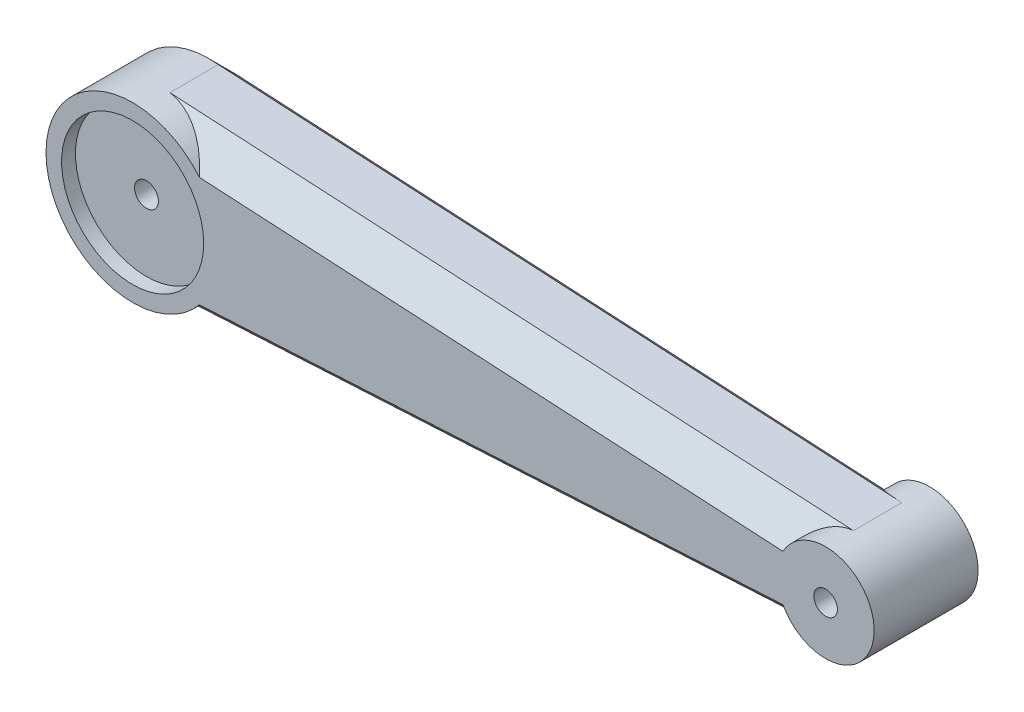
ISO-10303-21;
HEADER;
FILE_DESCRIPTION(('STEP AP214'),'2;1');
FILE_NAME('part.step','',(''),(''),'','','');
FILE_SCHEMA(('AUTOMOTIVE_DESIGN { 1 0 10303 214 1 1 1 1 }'));
ENDSEC;
DATA;
#1=APPLICATION_CONTEXT('core data for automotive mechanical design processes');
#2=APPLICATION_PROTOCOL_DEFINITION('international standard','automotive_design',2000,#1);
#3=PRODUCT_CONTEXT('',#1,'mechanical');
#4=PRODUCT('Part','Part','',(#3));
#5=PRODUCT_RELATED_PRODUCT_CATEGORY('part','',(#4));
#6=PRODUCT_DEFINITION_FORMATION('','',#4);
#7=PRODUCT_DEFINITION_CONTEXT('part definition',#1,'design');
#8=PRODUCT_DEFINITION('design','',#6,#7);
#9=PRODUCT_DEFINITION_SHAPE('','',#8);
#10=(LENGTH_UNIT() NAMED_UNIT(*) SI_UNIT(.MILLI.,.METRE.));
#11=(NAMED_UNIT(*) PLANE_ANGLE_UNIT() SI_UNIT($,.RADIAN.));
#12=(NAMED_UNIT(*) SI_UNIT($,.STERADIAN.) SOLID_ANGLE_UNIT());
#13=UNCERTAINTY_MEASURE_WITH_UNIT(LENGTH_MEASURE(1.E-05),#10,'distance_accuracy_value','');
#14=(GEOMETRIC_REPRESENTATION_CONTEXT(3) GLOBAL_UNCERTAINTY_ASSIGNED_CONTEXT((#13)) GLOBAL_UNIT_ASSIGNED_CONTEXT((#10,
#11,#12)) REPRESENTATION_CONTEXT('',''));
#15=CARTESIAN_POINT('',(0.,0.,0.));
#16=DIRECTION('',(0.,0.,1.));
#17=DIRECTION('',(1.,0.,0.));
#18=AXIS2_PLACEMENT_3D('',#15,#16,#17);
#19=CARTESIAN_POINT('',(0.,0.,15.));
#20=DIRECTION('',(0.,0.,-1.));
#21=DIRECTION('',(-1.,0.,0.));
#22=AXIS2_PLACEMENT_3D('',#19,#20,#21);
#23=CYLINDRICAL_SURFACE('',#22,12.5);
#24=CARTESIAN_POINT('',(0.,0.,15.));
#25=DIRECTION('',(0.,0.,1.));
#26=DIRECTION('',(1.,0.,0.));
#27=AXIS2_PLACEMENT_3D('',#24,#25,#26);
#28=CIRCLE('',#27,12.5);
#29=CARTESIAN_POINT('',(9.6345111325816,7.96405645611339,15.));
#30=VERTEX_POINT('',#29);
#31=CARTESIAN_POINT('',(9.6345111325816,-7.96405645611338,15.));
#32=VERTEX_POINT('',#31);
#33=EDGE_CURVE('E298',#30,#32,#28,.T.);
#34=ORIENTED_EDGE('',*,*,#33,.F.);
#35=CARTESIAN_POINT('',(0.,0.,23.4811365357126));
#36=DIRECTION('',(0.0388321836377974,0.706039702505407,0.707106781186545));
#37=DIRECTION('',(0.0388321836377972,0.706039702505403,-0.70710678118655));
#38=AXIS2_PLACEMENT_3D('',#35,#36,#37);
#39=ELLIPSE('',#38,17.6776695296637,12.5);
#40=CARTESIAN_POINT('',(1.37085316916331,12.424603075696,11.));
#41=VERTEX_POINT('',#40);
#42=EDGE_CURVE('E54',#30,#41,#39,.T.);
#43=ORIENTED_EDGE('',*,*,#42,.T.);
#44=DIRECTION('',(0.,0.,-1.));
#45=VECTOR('',#44,1.);
#46=CARTESIAN_POINT('',(1.37085316916331,12.424603075696,15.));
#47=LINE('',#46,#45);
#48=CARTESIAN_POINT('',(1.37085316916331,12.424603075696,3.99999999999999));
#49=VERTEX_POINT('',#48);
#50=EDGE_CURVE('E305',#41,#49,#47,.T.);
#51=ORIENTED_EDGE('',*,*,#50,.T.);
#52=CARTESIAN_POINT('',(0.,0.,3.99999999999999));
#53=DIRECTION('',(0.,0.,1.));
#54=DIRECTION('',(1.,0.,0.));
#55=AXIS2_PLACEMENT_3D('',#52,#53,#54);
#56=CIRCLE('',#55,12.5);
#57=CARTESIAN_POINT('',(1.37085316916331,-12.424603075696,3.99999999999999));
#58=VERTEX_POINT('',#57);
#59=EDGE_CURVE('E151',#49,#58,#56,.T.);
#60=ORIENTED_EDGE('',*,*,#59,.T.);
#61=DIRECTION('',(0.,0.,-1.));
#62=VECTOR('',#61,1.);
#63=CARTESIAN_POINT('',(1.37085316916331,-12.424603075696,15.));
#64=LINE('',#63,#62);
#65=CARTESIAN_POINT('',(1.37085316916331,-12.424603075696,11.));
#66=VERTEX_POINT('',#65);
#67=EDGE_CURVE('E121',#66,#58,#64,.T.);
#68=ORIENTED_EDGE('',*,*,#67,.F.);
#69=CARTESIAN_POINT('',(0.,0.,23.4811365357126));
#70=DIRECTION('',(0.0388321836377974,-0.706039702505407,0.707106781186545));
#71=DIRECTION('',(0.0388321836377972,-0.706039702505403,-0.70710678118655));
#72=AXIS2_PLACEMENT_3D('',#69,#70,#71);
#73=ELLIPSE('',#72,17.6776695296637,12.5);
#74=EDGE_CURVE('E329',#66,#32,#73,.T.);
#75=ORIENTED_EDGE('',*,*,#74,.T.);
#76=EDGE_LOOP('',(#34,#43,#51,#60,#68,#75));
#77=FACE_BOUND('',#76,.T.);
#78=ADVANCED_FACE('F43',(#77),#23,.T.);
#79=CARTESIAN_POINT('',(1.37085316916331,-12.424603075696,15.));
#80=DIRECTION('',(-0.0549170007571355,0.998490922857009,0.));
#81=DIRECTION('',(-0.998490922857009,-0.0549170007571355,0.));
#82=AXIS2_PLACEMENT_3D('',#79,#80,#81);
#83=PLANE('',#82);
#84=DIRECTION('',(0.,0.,-1.));
#85=VECTOR('',#84,1.);
#86=CARTESIAN_POINT('',(100.,-7.,15.));
#87=LINE('',#86,#85);
#88=CARTESIAN_POINT('',(100.,-7.,11.));
#89=VERTEX_POINT('',#88);
#90=CARTESIAN_POINT('',(100.,-7.,3.99999999999999));
#91=VERTEX_POINT('',#90);
#92=EDGE_CURVE('E110',#89,#91,#87,.T.);
#93=ORIENTED_EDGE('',*,*,#92,.F.);
#94=DIRECTION('',(-0.998490922857009,-0.0549170007571355,0.));
#95=VECTOR('',#94,1.);
#96=CARTESIAN_POINT('',(1.37085316916331,-12.424603075696,11.));
#97=LINE('',#96,#95);
#98=EDGE_CURVE('E325',#89,#66,#97,.T.);
#99=ORIENTED_EDGE('',*,*,#98,.T.);
#100=ORIENTED_EDGE('',*,*,#67,.T.);
#101=DIRECTION('',(0.998490922857009,0.0549170007571355,0.));
#102=VECTOR('',#101,1.);
#103=CARTESIAN_POINT('',(1.37085316916331,-12.424603075696,3.99999999999999));
#104=LINE('',#103,#102);
#105=EDGE_CURVE('E128',#58,#91,#104,.T.);
#106=ORIENTED_EDGE('',*,*,#105,.T.);
#107=EDGE_LOOP('',(#93,#99,#100,#106));
#108=FACE_BOUND('',#107,.T.);
#109=ADVANCED_FACE('F134',(#108),#83,.F.);
#110=CARTESIAN_POINT('',(100.,0.,15.));
#111=DIRECTION('',(0.,0.,-1.));
#112=DIRECTION('',(-1.,0.,0.));
#113=AXIS2_PLACEMENT_3D('',#110,#111,#112);
#114=CYLINDRICAL_SURFACE('',#113,7.);
#115=CARTESIAN_POINT('',(100.,0.,0.));
#116=DIRECTION('',(0.,0.,1.));
#117=DIRECTION('',(1.,0.,0.));
#118=AXIS2_PLACEMENT_3D('',#115,#116,#117);
#119=CIRCLE('',#118,7.);
#120=CARTESIAN_POINT('',(93.8441674223716,-3.33252536017493,0.));
#121=VERTEX_POINT('',#120);
#122=CARTESIAN_POINT('',(93.8441674223716,3.33252536017493,0.));
#123=VERTEX_POINT('',#122);
#124=EDGE_CURVE('E302',#121,#123,#119,.T.);
#125=ORIENTED_EDGE('',*,*,#124,.T.);
#126=CARTESIAN_POINT('',(100.,0.,-2.98943645999901));
#127=DIRECTION('',(-0.0388321836377971,-0.706039702505402,0.70710678118655));
#128=DIRECTION('',(-0.0388321836377974,-0.706039702505408,-0.707106781186545));
#129=AXIS2_PLACEMENT_3D('',#126,#127,#128);
#130=ELLIPSE('',#129,9.89949493661162,7.);
#131=CARTESIAN_POINT('',(100.,7.,3.99999999999999));
#132=VERTEX_POINT('',#131);
#133=EDGE_CURVE('E131',#123,#132,#130,.F.);
#134=ORIENTED_EDGE('',*,*,#133,.T.);
#135=DIRECTION('',(0.,0.,-1.));
#136=VECTOR('',#135,1.);
#137=CARTESIAN_POINT('',(100.,7.,15.));
#138=LINE('',#137,#136);
#139=CARTESIAN_POINT('',(100.,7.,11.));
#140=VERTEX_POINT('',#139);
#141=EDGE_CURVE('E122',#140,#132,#138,.T.);
#142=ORIENTED_EDGE('',*,*,#141,.F.);
#143=CARTESIAN_POINT('',(100.,0.,17.9894364599991));
#144=DIRECTION('',(0.0388321836377974,0.706039702505407,0.707106781186545));
#145=DIRECTION('',(0.0388321836377972,0.706039702505403,-0.70710678118655));
#146=AXIS2_PLACEMENT_3D('',#143,#144,#145);
#147=ELLIPSE('',#146,9.89949493661169,7.);
#148=CARTESIAN_POINT('',(93.8441674223716,3.33252536017493,15.));
#149=VERTEX_POINT('',#148);
#150=EDGE_CURVE('E11',#140,#149,#147,.T.);
#151=ORIENTED_EDGE('',*,*,#150,.T.);
#152=CARTESIAN_POINT('',(100.,0.,15.));
#153=DIRECTION('',(0.,0.,1.));
#154=DIRECTION('',(1.,0.,0.));
#155=AXIS2_PLACEMENT_3D('',#152,#153,#154);
#156=CIRCLE('',#155,7.);
#157=CARTESIAN_POINT('',(93.8441674223716,-3.33252536017493,15.));
#158=VERTEX_POINT('',#157);
#159=EDGE_CURVE('E301',#158,#149,#156,.T.);
#160=ORIENTED_EDGE('',*,*,#159,.F.);
#161=CARTESIAN_POINT('',(100.,0.,17.9894364599991));
#162=DIRECTION('',(0.0388321836377974,-0.706039702505407,0.707106781186545));
#163=DIRECTION('',(0.0388321836377972,-0.706039702505403,-0.70710678118655));
#164=AXIS2_PLACEMENT_3D('',#161,#162,#163);
#165=ELLIPSE('',#164,9.89949493661169,7.);
#166=EDGE_CURVE('E116',#158,#89,#165,.T.);
#167=ORIENTED_EDGE('',*,*,#166,.T.);
#168=ORIENTED_EDGE('',*,*,#92,.T.);
#169=CARTESIAN_POINT('',(100.,0.,-2.98943645999901));
#170=DIRECTION('',(-0.0388321836377971,0.706039702505402,0.70710678118655));
#171=DIRECTION('',(-0.0388321836377974,0.706039702505408,-0.707106781186545));
#172=AXIS2_PLACEMENT_3D('',#169,#170,#171);
#173=ELLIPSE('',#172,9.89949493661162,7.);
#174=EDGE_CURVE('E113',#91,#121,#173,.F.);
#175=ORIENTED_EDGE('',*,*,#174,.T.);
#176=EDGE_LOOP('',(#125,#134,#142,#151,#160,#167,#168,#175));
#177=FACE_BOUND('',#176,.T.);
#178=ADVANCED_FACE('F112',(#177),#114,.T.);
#179=CARTESIAN_POINT('',(1.37085316916331,12.424603075696,15.));
#180=DIRECTION('',(-0.0549170007571355,-0.998490922857009,0.));
#181=DIRECTION('',(0.998490922857009,-0.0549170007571355,0.));
#182=AXIS2_PLACEMENT_3D('',#179,#180,#181);
#183=PLANE('',#182);
#184=ORIENTED_EDGE('',*,*,#50,.F.);
#185=DIRECTION('',(0.998490922857009,-0.0549170007571355,0.));
#186=VECTOR('',#185,1.);
#187=CARTESIAN_POINT('',(100.,7.,11.));
#188=LINE('',#187,#186);
#189=EDGE_CURVE('E67',#41,#140,#188,.T.);
#190=ORIENTED_EDGE('',*,*,#189,.T.);
#191=ORIENTED_EDGE('',*,*,#141,.T.);
#192=DIRECTION('',(-0.998490922857009,0.0549170007571355,0.));
#193=VECTOR('',#192,1.);
#194=CARTESIAN_POINT('',(1.37085316916331,12.424603075696,3.99999999999999));
#195=LINE('',#194,#193);
#196=EDGE_CURVE('E132',#132,#49,#195,.T.);
#197=ORIENTED_EDGE('',*,*,#196,.T.);
#198=EDGE_LOOP('',(#184,#190,#191,#197));
#199=FACE_BOUND('',#198,.T.);
#200=ADVANCED_FACE('F222',(#199),#183,.F.);
#201=CARTESIAN_POINT('',(0.,0.,15.));
#202=DIRECTION('',(0.,0.,1.));
#203=DIRECTION('',(1.,0.,0.));
#204=AXIS2_PLACEMENT_3D('',#201,#202,#203);
#205=PLANE('',#204);
#206=CARTESIAN_POINT('',(100.,0.,15.));
#207=DIRECTION('',(0.,0.,-1.));
#208=DIRECTION('',(-1.,0.,0.));
#209=AXIS2_PLACEMENT_3D('',#206,#207,#208);
#210=CIRCLE('',#209,1.69999999999999);
#211=CARTESIAN_POINT('',(98.3,0.,15.));
#212=VERTEX_POINT('',#211);
#213=EDGE_CURVE('E269',#212,#212,#210,.T.);
#214=ORIENTED_EDGE('',*,*,#213,.T.);
#215=EDGE_LOOP('',(#214));
#216=FACE_BOUND('',#215,.T.);
#217=CARTESIAN_POINT('',(0.,0.,15.));
#218=DIRECTION('',(0.,0.,1.));
#219=DIRECTION('',(1.,0.,0.));
#220=AXIS2_PLACEMENT_3D('',#217,#218,#219);
#221=CIRCLE('',#220,10.25);
#222=CARTESIAN_POINT('',(10.25,0.,15.));
#223=VERTEX_POINT('',#222);
#224=EDGE_CURVE('E294',#223,#223,#221,.T.);
#225=ORIENTED_EDGE('',*,*,#224,.F.);
#226=EDGE_LOOP('',(#225));
#227=FACE_BOUND('',#226,.T.);
#228=DIRECTION('',(0.998490922857009,0.0549170007571355,0.));
#229=VECTOR('',#228,1.);
#230=CARTESIAN_POINT('',(99.7803319969715,-3.00603630857194,15.));
#231=LINE('',#230,#229);
#232=EDGE_CURVE('E331',#32,#158,#231,.T.);
#233=ORIENTED_EDGE('',*,*,#232,.T.);
#234=ORIENTED_EDGE('',*,*,#159,.T.);
#235=DIRECTION('',(-0.998490922857009,0.0549170007571355,0.));
#236=VECTOR('',#235,1.);
#237=CARTESIAN_POINT('',(1.15118516613476,8.43063938426796,15.));
#238=LINE('',#237,#236);
#239=EDGE_CURVE('E160',#149,#30,#238,.T.);
#240=ORIENTED_EDGE('',*,*,#239,.T.);
#241=ORIENTED_EDGE('',*,*,#33,.T.);
#242=EDGE_LOOP('',(#233,#234,#240,#241));
#243=FACE_BOUND('',#242,.T.);
#244=ADVANCED_FACE('F225',(#216,#227,#243),#205,.T.);
#245=CARTESIAN_POINT('',(0.,0.,0.));
#246=DIRECTION('',(0.,0.,1.));
#247=DIRECTION('',(1.,0.,0.));
#248=AXIS2_PLACEMENT_3D('',#245,#246,#247);
#249=PLANE('',#248);
#250=CARTESIAN_POINT('',(100.,0.,0.));
#251=DIRECTION('',(0.,0.,-1.));
#252=DIRECTION('',(-1.,0.,0.));
#253=AXIS2_PLACEMENT_3D('',#250,#251,#252);
#254=CIRCLE('',#253,1.725);
#255=CARTESIAN_POINT('',(98.275,0.,0.));
#256=VERTEX_POINT('',#255);
#257=EDGE_CURVE('E265',#256,#256,#254,.T.);
#258=ORIENTED_EDGE('',*,*,#257,.F.);
#259=EDGE_LOOP('',(#258));
#260=FACE_BOUND('',#259,.T.);
#261=CARTESIAN_POINT('',(0.,0.,0.));
#262=DIRECTION('',(0.,0.,-1.));
#263=DIRECTION('',(-1.,0.,0.));
#264=AXIS2_PLACEMENT_3D('',#261,#262,#263);
#265=CIRCLE('',#264,6.145);
#266=CARTESIAN_POINT('',(-6.145,0.,0.));
#267=VERTEX_POINT('',#266);
#268=EDGE_CURVE('E275',#267,#267,#265,.T.);
#269=ORIENTED_EDGE('',*,*,#268,.F.);
#270=EDGE_LOOP('',(#269));
#271=FACE_BOUND('',#270,.T.);
#272=ORIENTED_EDGE('',*,*,#124,.F.);
#273=DIRECTION('',(-0.998490922857009,-0.0549170007571355,0.));
#274=VECTOR('',#273,1.);
#275=CARTESIAN_POINT('',(0.465758581553097,-8.46833784641995,0.));
#276=LINE('',#275,#274);
#277=CARTESIAN_POINT('',(1.03087539041,-8.43725642193282,0.));
#278=VERTEX_POINT('',#277);
#279=EDGE_CURVE('E129',#121,#278,#276,.T.);
#280=ORIENTED_EDGE('',*,*,#279,.T.);
#281=CARTESIAN_POINT('',(0.,0.,0.));
#282=DIRECTION('',(0.,0.,1.));
#283=DIRECTION('',(1.,0.,0.));
#284=AXIS2_PLACEMENT_3D('',#281,#282,#283);
#285=CIRCLE('',#284,8.49999999999998);
#286=CARTESIAN_POINT('',(1.03087539041001,8.43725642193282,0.));
#287=VERTEX_POINT('',#286);
#288=EDGE_CURVE('E143',#278,#287,#285,.F.);
#289=ORIENTED_EDGE('',*,*,#288,.T.);
#290=DIRECTION('',(0.998490922857009,-0.0549170007571355,0.));
#291=VECTOR('',#290,1.);
#292=CARTESIAN_POINT('',(0.465758581553097,8.46833784641995,0.));
#293=LINE('',#292,#291);
#294=EDGE_CURVE('E138',#287,#123,#293,.T.);
#295=ORIENTED_EDGE('',*,*,#294,.T.);
#296=EDGE_LOOP('',(#272,#280,#289,#295));
#297=FACE_BOUND('',#296,.T.);
#298=ADVANCED_FACE('F195',(#260,#271,#297),#249,.F.);
#299=CARTESIAN_POINT('',(1.37085316916331,12.424603075696,3.99999999999999));
#300=DIRECTION('',(-0.0388321836377971,-0.706039702505402,0.70710678118655));
#301=DIRECTION('',(-0.998490922857009,0.0549170007571355,0.));
#302=AXIS2_PLACEMENT_3D('',#299,#300,#301);
#303=PLANE('',#302);
#304=ORIENTED_EDGE('',*,*,#133,.F.);
#305=ORIENTED_EDGE('',*,*,#294,.F.);
#306=CARTESIAN_POINT('',(1.03087539041001,8.43725642193282,0.));
#307=CARTESIAN_POINT('',(1.08946054664299,9.10167954767803,0.66663778106207));
#308=CARTESIAN_POINT('',(1.1470846117841,9.76617006468496,1.33329007144703));
#309=CARTESIAN_POINT('',(1.26041053726804,11.0952856159932,2.66662340479194));
#310=CARTESIAN_POINT('',(1.31611239837803,11.7599106502406,3.33330444774031));
#311=CARTESIAN_POINT('',(1.3708531691633,12.424603075696,3.99999999999999));
#312=B_SPLINE_CURVE_WITH_KNOTS('',3,(#306,#307,#308,#309,#310,#311),.UNSPECIFIED.,.F.,.F.,(4,2,
4),(0.,2.82907071441478,5.65814029973017),.UNSPECIFIED.);
#313=EDGE_CURVE('E170',#49,#287,#312,.F.);
#314=ORIENTED_EDGE('',*,*,#313,.F.);
#315=ORIENTED_EDGE('',*,*,#196,.F.);
#316=EDGE_LOOP('',(#304,#305,#314,#315));
#317=FACE_BOUND('',#316,.T.);
#318=ADVANCED_FACE('F188',(#317),#303,.F.);
#319=CARTESIAN_POINT('',(0.,0.,3.99999999999999));
#320=DIRECTION('',(0.,0.,1.));
#321=DIRECTION('',(1.,0.,0.));
#322=AXIS2_PLACEMENT_3D('',#319,#320,#321);
#323=CONICAL_SURFACE('',#322,12.5,0.785398163397452);
#324=ORIENTED_EDGE('',*,*,#313,.T.);
#325=ORIENTED_EDGE('',*,*,#288,.F.);
#326=CARTESIAN_POINT('',(1.03087539041,-8.43725642193282,0.));
#327=CARTESIAN_POINT('',(1.08946054664298,-9.10167954767803,0.66663778106207));
#328=CARTESIAN_POINT('',(1.14708461178409,-9.76617006468497,1.33329007144703));
#329=CARTESIAN_POINT('',(1.26041053726803,-11.0952856159932,2.66662340479194));
#330=CARTESIAN_POINT('',(1.31611239837802,-11.7599106502406,3.33330444774031));
#331=CARTESIAN_POINT('',(1.3708531691633,-12.424603075696,3.99999999999999));
#332=B_SPLINE_CURVE_WITH_KNOTS('',3,(#326,#327,#328,#329,#330,#331),.UNSPECIFIED.,.F.,.F.,(4,2,
4),(0.,2.82907071441478,5.65814029973017),.UNSPECIFIED.);
#333=EDGE_CURVE('E161',#58,#278,#332,.F.);
#334=ORIENTED_EDGE('',*,*,#333,.F.);
#335=ORIENTED_EDGE('',*,*,#59,.F.);
#336=EDGE_LOOP('',(#324,#325,#334,#335));
#337=FACE_BOUND('',#336,.T.);
#338=ADVANCED_FACE('F182',(#337),#323,.T.);
#339=CARTESIAN_POINT('',(1.37085316916331,-12.424603075696,3.99999999999999));
#340=DIRECTION('',(-0.0388321836377971,0.706039702505402,0.70710678118655));
#341=DIRECTION('',(0.998490922857009,0.0549170007571355,0.));
#342=AXIS2_PLACEMENT_3D('',#339,#340,#341);
#343=PLANE('',#342);
#344=ORIENTED_EDGE('',*,*,#333,.T.);
#345=ORIENTED_EDGE('',*,*,#279,.F.);
#346=ORIENTED_EDGE('',*,*,#174,.F.);
#347=ORIENTED_EDGE('',*,*,#105,.F.);
#348=EDGE_LOOP('',(#344,#345,#346,#347));
#349=FACE_BOUND('',#348,.T.);
#350=ADVANCED_FACE('F127',(#349),#343,.F.);
#351=CARTESIAN_POINT('',(0.,0.,13.));
#352=DIRECTION('',(0.,0.,1.));
#353=DIRECTION('',(1.,0.,0.));
#354=AXIS2_PLACEMENT_3D('',#351,#352,#353);
#355=CYLINDRICAL_SURFACE('',#354,10.25);
#356=CARTESIAN_POINT('',(0.,0.,13.));
#357=DIRECTION('',(0.,0.,1.));
#358=DIRECTION('',(1.,0.,0.));
#359=AXIS2_PLACEMENT_3D('',#356,#357,#358);
#360=CIRCLE('',#359,10.25);
#361=CARTESIAN_POINT('',(10.25,0.,13.));
#362=VERTEX_POINT('',#361);
#363=EDGE_CURVE('E171',#362,#362,#360,.T.);
#364=ORIENTED_EDGE('',*,*,#363,.F.);
#365=EDGE_LOOP('',(#364));
#366=FACE_BOUND('',#365,.T.);
#367=ORIENTED_EDGE('',*,*,#224,.T.);
#368=EDGE_LOOP('',(#367));
#369=FACE_BOUND('',#368,.T.);
#370=ADVANCED_FACE('F210',(#366,#369),#355,.F.);
#371=CARTESIAN_POINT('',(0.,0.,13.));
#372=DIRECTION('',(0.,0.,1.));
#373=DIRECTION('',(1.,0.,0.));
#374=AXIS2_PLACEMENT_3D('',#371,#372,#373);
#375=PLANE('',#374);
#376=CARTESIAN_POINT('',(0.,0.,13.));
#377=DIRECTION('',(0.,0.,1.));
#378=DIRECTION('',(1.,0.,0.));
#379=AXIS2_PLACEMENT_3D('',#376,#377,#378);
#380=CIRCLE('',#379,1.725);
#381=CARTESIAN_POINT('',(1.725,0.,13.));
#382=VERTEX_POINT('',#381);
#383=EDGE_CURVE('E48',#382,#382,#380,.T.);
#384=ORIENTED_EDGE('',*,*,#383,.F.);
#385=EDGE_LOOP('',(#384));
#386=FACE_BOUND('',#385,.T.);
#387=ORIENTED_EDGE('',*,*,#363,.T.);
#388=EDGE_LOOP('',(#387));
#389=FACE_BOUND('',#388,.T.);
#390=ADVANCED_FACE('F202',(#386,#389),#375,.T.);
#391=CARTESIAN_POINT('',(0.465758581553097,-8.46833784641995,15.));
#392=DIRECTION('',(0.0388321836377974,-0.706039702505407,0.707106781186545));
#393=DIRECTION('',(-0.998490922857009,-0.0549170007571355,0.));
#394=AXIS2_PLACEMENT_3D('',#391,#392,#393);
#395=PLANE('',#394);
#396=ORIENTED_EDGE('',*,*,#74,.F.);
#397=ORIENTED_EDGE('',*,*,#98,.F.);
#398=ORIENTED_EDGE('',*,*,#166,.F.);
#399=ORIENTED_EDGE('',*,*,#232,.F.);
#400=EDGE_LOOP('',(#396,#397,#398,#399));
#401=FACE_BOUND('',#400,.T.);
#402=ADVANCED_FACE('F198',(#401),#395,.T.);
#403=CARTESIAN_POINT('',(0.465758581553097,8.46833784641995,15.));
#404=DIRECTION('',(0.0388321836377974,0.706039702505407,0.707106781186545));
#405=DIRECTION('',(0.998490922857009,-0.0549170007571355,0.));
#406=AXIS2_PLACEMENT_3D('',#403,#404,#405);
#407=PLANE('',#406);
#408=ORIENTED_EDGE('',*,*,#150,.F.);
#409=ORIENTED_EDGE('',*,*,#189,.F.);
#410=ORIENTED_EDGE('',*,*,#42,.F.);
#411=ORIENTED_EDGE('',*,*,#239,.F.);
#412=EDGE_LOOP('',(#408,#409,#410,#411));
#413=FACE_BOUND('',#412,.T.);
#414=ADVANCED_FACE('F46',(#413),#407,.T.);
#415=CARTESIAN_POINT('',(0.,0.,0.));
#416=DIRECTION('',(0.,0.,-1.));
#417=DIRECTION('',(-1.,0.,0.));
#418=AXIS2_PLACEMENT_3D('',#415,#416,#417);
#419=CYLINDRICAL_SURFACE('',#418,1.725);
#420=ORIENTED_EDGE('',*,*,#383,.T.);
#421=EDGE_LOOP('',(#420));
#422=FACE_BOUND('',#421,.T.);
#423=CARTESIAN_POINT('',(0.,0.,8.));
#424=DIRECTION('',(0.,0.,-1.));
#425=DIRECTION('',(-1.,0.,0.));
#426=AXIS2_PLACEMENT_3D('',#423,#424,#425);
#427=CIRCLE('',#426,1.725);
#428=CARTESIAN_POINT('',(-1.725,0.,8.));
#429=VERTEX_POINT('',#428);
#430=EDGE_CURVE('E287',#429,#429,#427,.T.);
#431=ORIENTED_EDGE('',*,*,#430,.T.);
#432=EDGE_LOOP('',(#431));
#433=FACE_BOUND('',#432,.T.);
#434=ADVANCED_FACE('F208',(#422,#433),#419,.F.);
#435=CARTESIAN_POINT('',(4.,0.,8.));
#436=DIRECTION('',(0.,0.,1.));
#437=DIRECTION('',(1.,0.,0.));
#438=AXIS2_PLACEMENT_3D('',#435,#436,#437);
#439=PLANE('',#438);
#440=ORIENTED_EDGE('',*,*,#430,.F.);
#441=EDGE_LOOP('',(#440));
#442=FACE_BOUND('',#441,.T.);
#443=CARTESIAN_POINT('',(0.,0.,8.));
#444=DIRECTION('',(0.,0.,-1.));
#445=DIRECTION('',(-1.,0.,0.));
#446=AXIS2_PLACEMENT_3D('',#443,#444,#445);
#447=CIRCLE('',#446,4.);
#448=CARTESIAN_POINT('',(-4.,0.,8.));
#449=VERTEX_POINT('',#448);
#450=EDGE_CURVE('E283',#449,#449,#447,.T.);
#451=ORIENTED_EDGE('',*,*,#450,.T.);
#452=EDGE_LOOP('',(#451));
#453=FACE_BOUND('',#452,.T.);
#454=ADVANCED_FACE('F237',(#442,#453),#439,.F.);
#455=CARTESIAN_POINT('',(0.,0.,0.));
#456=DIRECTION('',(0.,0.,-1.));
#457=DIRECTION('',(-1.,0.,0.));
#458=AXIS2_PLACEMENT_3D('',#455,#456,#457);
#459=CYLINDRICAL_SURFACE('',#458,4.);
#460=ORIENTED_EDGE('',*,*,#450,.F.);
#461=EDGE_LOOP('',(#460));
#462=FACE_BOUND('',#461,.T.);
#463=CARTESIAN_POINT('',(0.,0.,2.145));
#464=DIRECTION('',(0.,0.,-1.));
#465=DIRECTION('',(-1.,0.,0.));
#466=AXIS2_PLACEMENT_3D('',#463,#464,#465);
#467=CIRCLE('',#466,4.);
#468=CARTESIAN_POINT('',(-4.,0.,2.145));
#469=VERTEX_POINT('',#468);
#470=EDGE_CURVE('E279',#469,#469,#467,.T.);
#471=ORIENTED_EDGE('',*,*,#470,.T.);
#472=EDGE_LOOP('',(#471));
#473=FACE_BOUND('',#472,.T.);
#474=ADVANCED_FACE('F241',(#462,#473),#459,.F.);
#475=CARTESIAN_POINT('',(0.,0.,0.));
#476=DIRECTION('',(0.,0.,-1.));
#477=DIRECTION('',(-1.,0.,0.));
#478=AXIS2_PLACEMENT_3D('',#475,#476,#477);
#479=CONICAL_SURFACE('',#478,6.145,0.785398163397447);
#480=ORIENTED_EDGE('',*,*,#470,.F.);
#481=EDGE_LOOP('',(#480));
#482=FACE_BOUND('',#481,.T.);
#483=ORIENTED_EDGE('',*,*,#268,.T.);
#484=EDGE_LOOP('',(#483));
#485=FACE_BOUND('',#484,.T.);
#486=ADVANCED_FACE('F245',(#482,#485),#479,.F.);
#487=CARTESIAN_POINT('',(100.,0.,0.));
#488=DIRECTION('',(0.,0.,-1.));
#489=DIRECTION('',(-1.,0.,0.));
#490=AXIS2_PLACEMENT_3D('',#487,#488,#489);
#491=CYLINDRICAL_SURFACE('',#490,1.69999999999999);
#492=ORIENTED_EDGE('',*,*,#213,.F.);
#493=EDGE_LOOP('',(#492));
#494=FACE_BOUND('',#493,.T.);
#495=CARTESIAN_POINT('',(100.,0.,0.0250000000000042));
#496=DIRECTION('',(0.,0.,-1.));
#497=DIRECTION('',(-1.,0.,0.));
#498=AXIS2_PLACEMENT_3D('',#495,#496,#497);
#499=CIRCLE('',#498,1.69999999999999);
#500=CARTESIAN_POINT('',(98.3,0.,0.0250000000000042));
#501=VERTEX_POINT('',#500);
#502=EDGE_CURVE('E262',#501,#501,#499,.T.);
#503=ORIENTED_EDGE('',*,*,#502,.T.);
#504=EDGE_LOOP('',(#503));
#505=FACE_BOUND('',#504,.T.);
#506=ADVANCED_FACE('F249',(#494,#505),#491,.F.);
#507=CARTESIAN_POINT('',(100.,0.,0.));
#508=DIRECTION('',(0.,0.,-1.));
#509=DIRECTION('',(-1.,0.,0.));
#510=AXIS2_PLACEMENT_3D('',#507,#508,#509);
#511=CONICAL_SURFACE('',#510,1.725,0.785398163397587);
#512=ORIENTED_EDGE('',*,*,#502,.F.);
#513=EDGE_LOOP('',(#512));
#514=FACE_BOUND('',#513,.T.);
#515=ORIENTED_EDGE('',*,*,#257,.T.);
#516=EDGE_LOOP('',(#515));
#517=FACE_BOUND('',#516,.T.);
#518=ADVANCED_FACE('F253',(#514,#517),#511,.F.);
#519=CLOSED_SHELL('',(#78,#109,#178,#200,#244,#298,#318,#338,#350,#370,#390,#402,#414,#434,#454,
#474,#486,#506,#518));
#520=MANIFOLD_SOLID_BREP('B2',#519);
#521=ADVANCED_BREP_SHAPE_REPRESENTATION('',(#18,#520),#14);
#522=SHAPE_DEFINITION_REPRESENTATION(#9,#521);
ENDSEC;
END-ISO-10303-21;
